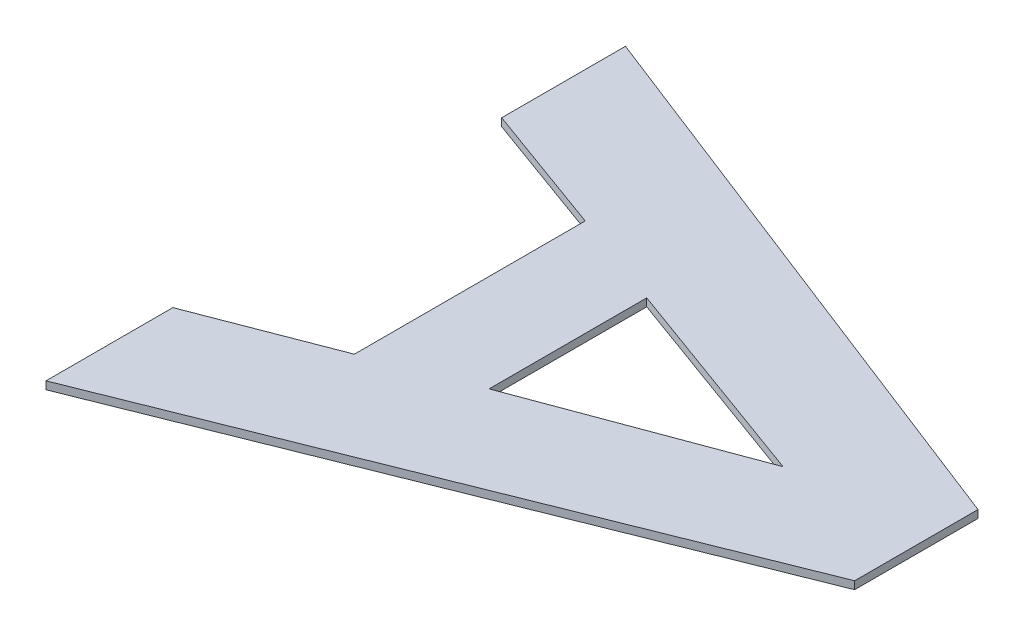
ISO-10303-21;
HEADER;
FILE_DESCRIPTION(('STEP AP214'),'2;1');
FILE_NAME('part.step','',(''),(''),'','','');
FILE_SCHEMA(('AUTOMOTIVE_DESIGN { 1 0 10303 214 1 1 1 1 }'));
ENDSEC;
DATA;
#1=APPLICATION_CONTEXT('core data for automotive mechanical design processes');
#2=APPLICATION_PROTOCOL_DEFINITION('international standard','automotive_design',2000,#1);
#3=PRODUCT_CONTEXT('',#1,'mechanical');
#4=PRODUCT('Part','Part','',(#3));
#5=PRODUCT_RELATED_PRODUCT_CATEGORY('part','',(#4));
#6=PRODUCT_DEFINITION_FORMATION('','',#4);
#7=PRODUCT_DEFINITION_CONTEXT('part definition',#1,'design');
#8=PRODUCT_DEFINITION('design','',#6,#7);
#9=PRODUCT_DEFINITION_SHAPE('','',#8);
#10=(LENGTH_UNIT() NAMED_UNIT(*) SI_UNIT(.MILLI.,.METRE.));
#11=(NAMED_UNIT(*) PLANE_ANGLE_UNIT() SI_UNIT($,.RADIAN.));
#12=(NAMED_UNIT(*) SI_UNIT($,.STERADIAN.) SOLID_ANGLE_UNIT());
#13=UNCERTAINTY_MEASURE_WITH_UNIT(LENGTH_MEASURE(1.E-05),#10,'distance_accuracy_value','');
#14=(GEOMETRIC_REPRESENTATION_CONTEXT(3) GLOBAL_UNCERTAINTY_ASSIGNED_CONTEXT((#13)) GLOBAL_UNIT_ASSIGNED_CONTEXT((#10,
#11,#12)) REPRESENTATION_CONTEXT('',''));
#15=CARTESIAN_POINT('',(0.,0.,0.));
#16=DIRECTION('',(0.,0.,1.));
#17=DIRECTION('',(1.,0.,0.));
#18=AXIS2_PLACEMENT_3D('',#15,#16,#17);
#19=CARTESIAN_POINT('',(-8.631267976045,2.16,0.));
#20=DIRECTION('',(0.,1.,0.));
#21=DIRECTION('',(0.,0.,1.));
#22=AXIS2_PLACEMENT_3D('',#19,#20,#21);
#23=PLANE('',#22);
#24=DIRECTION('',(-0.933321058443034,0.,0.359042896973013));
#25=VECTOR('',#24,1.);
#26=CARTESIAN_POINT('',(-6.845573371896,2.16,4.641858652695));
#27=LINE('',#26,#25);
#28=CARTESIAN_POINT('',(0.200543494760665,2.16,1.93126063358213));
#29=VERTEX_POINT('',#28);
#30=CARTESIAN_POINT('',(0.369353284900612,2.16,1.86632054084499));
#31=VERTEX_POINT('',#30);
#32=EDGE_CURVE('E138',#29,#31,#27,.F.);
#33=ORIENTED_EDGE('',*,*,#32,.F.);
#34=DIRECTION('',(0.,0.,1.));
#35=VECTOR('',#34,1.);
#36=CARTESIAN_POINT('',(0.200543494761,2.16,0.));
#37=LINE('',#36,#35);
#38=CARTESIAN_POINT('',(0.200543494760657,2.16,2.09455826731014));
#39=VERTEX_POINT('',#38);
#40=EDGE_CURVE('E142',#39,#29,#37,.F.);
#41=ORIENTED_EDGE('',*,*,#40,.F.);
#42=DIRECTION('',(0.928357969364077,0.,-0.371687342693031));
#43=VECTOR('',#42,1.);
#44=CARTESIAN_POINT('',(-6.688394158193,2.16,4.852687151533));
#45=LINE('',#44,#43);
#46=CARTESIAN_POINT('',(0.943995590928639,2.16,1.7969018210221));
#47=VERTEX_POINT('',#46);
#48=EDGE_CURVE('E149',#47,#39,#45,.F.);
#49=ORIENTED_EDGE('',*,*,#48,.F.);
#50=DIRECTION('',(0.,0.,-1.));
#51=VECTOR('',#50,1.);
#52=CARTESIAN_POINT('',(0.943995590929,2.16,0.));
#53=LINE('',#52,#51);
#54=CARTESIAN_POINT('',(0.943995590928882,2.16,1.6380828143813));
#55=VERTEX_POINT('',#54);
#56=EDGE_CURVE('E120',#55,#47,#53,.F.);
#57=ORIENTED_EDGE('',*,*,#56,.F.);
#58=DIRECTION('',(-0.931818169402854,0.,-0.362925473300943));
#59=VECTOR('',#58,1.);
#60=CARTESIAN_POINT('',(-7.924030848166,2.16,-1.815844999363));
#61=LINE('',#60,#59);
#62=CARTESIAN_POINT('',(0.200543494760863,2.16,1.34852234782436));
#63=VERTEX_POINT('',#62);
#64=EDGE_CURVE('E122',#63,#55,#61,.F.);
#65=ORIENTED_EDGE('',*,*,#64,.F.);
#66=DIRECTION('',(0.,0.,1.));
#67=VECTOR('',#66,1.);
#68=CARTESIAN_POINT('',(0.200543494761,2.16,0.));
#69=LINE('',#68,#67);
#70=CARTESIAN_POINT('',(0.200543494761343,2.16,1.50785811912906));
#71=VERTEX_POINT('',#70);
#72=EDGE_CURVE('E126',#71,#63,#69,.F.);
#73=ORIENTED_EDGE('',*,*,#72,.F.);
#74=DIRECTION('',(0.939905383184015,0.,0.341435016748005));
#75=VECTOR('',#74,1.);
#76=CARTESIAN_POINT('',(-8.085570917019,2.16,-1.502199769231));
#77=LINE('',#76,#75);
#78=CARTESIAN_POINT('',(0.369353284901296,2.16,1.56918085922019));
#79=VERTEX_POINT('',#78);
#80=EDGE_CURVE('E130',#79,#71,#77,.F.);
#81=ORIENTED_EDGE('',*,*,#80,.F.);
#82=DIRECTION('',(0.,0.,1.));
#83=VECTOR('',#82,1.);
#84=CARTESIAN_POINT('',(0.369353284901,2.16,0.));
#85=LINE('',#84,#83);
#86=EDGE_CURVE('E134',#31,#79,#85,.F.);
#87=ORIENTED_EDGE('',*,*,#86,.F.);
#88=EDGE_LOOP('',(#33,#41,#49,#57,#65,#73,#81,#87));
#89=FACE_BOUND('',#88,.T.);
#90=DIRECTION('',(0.939707761266112,0.,0.341978542333041));
#91=VECTOR('',#90,1.);
#92=CARTESIAN_POINT('',(-8.083092928394,2.16,-1.506306048607));
#93=LINE('',#92,#91);
#94=CARTESIAN_POINT('',(0.770707173703373,2.16,1.71576976882234));
#95=VERTEX_POINT('',#94);
#96=CARTESIAN_POINT('',(0.49475484329054,2.16,1.61534516917652));
#97=VERTEX_POINT('',#96);
#98=EDGE_CURVE('E20',#95,#97,#93,.F.);
#99=ORIENTED_EDGE('',*,*,#98,.F.);
#100=DIRECTION('',(-0.937430728936135,0.,0.34817183752605));
#101=VECTOR('',#100,1.);
#102=CARTESIAN_POINT('',(-6.931521521557,2.16,4.576460201831));
#103=LINE('',#102,#101);
#104=CARTESIAN_POINT('',(0.494754843290101,2.16,1.81826142712227));
#105=VERTEX_POINT('',#104);
#106=EDGE_CURVE('E102',#105,#95,#103,.F.);
#107=ORIENTED_EDGE('',*,*,#106,.F.);
#108=DIRECTION('',(0.,0.,-1.));
#109=VECTOR('',#108,1.);
#110=CARTESIAN_POINT('',(0.49475484329,2.16,0.));
#111=LINE('',#110,#109);
#112=EDGE_CURVE('E110',#97,#105,#111,.F.);
#113=ORIENTED_EDGE('',*,*,#112,.F.);
#114=EDGE_LOOP('',(#99,#107,#113));
#115=FACE_BOUND('',#114,.T.);
#116=ADVANCED_FACE('F17',(#89,#115),#23,.T.);
#117=CARTESIAN_POINT('',(-8.083092928394,2.16,-1.506306048607));
#118=DIRECTION('',(-0.341978542333041,0.,0.939707761266112));
#119=DIRECTION('',(0.939707761266112,0.,0.341978542333041));
#120=AXIS2_PLACEMENT_3D('',#117,#118,#119);
#121=PLANE('',#120);
#122=ORIENTED_EDGE('',*,*,#98,.T.);
#123=DIRECTION('',(0.,1.,0.));
#124=VECTOR('',#123,1.);
#125=CARTESIAN_POINT('',(0.49475484329,2.16,1.615345169178));
#126=LINE('',#125,#124);
#127=CARTESIAN_POINT('',(0.49475484329054,2.15,1.61534516917652));
#128=VERTEX_POINT('',#127);
#129=EDGE_CURVE('E114',#128,#97,#126,.T.);
#130=ORIENTED_EDGE('',*,*,#129,.F.);
#131=DIRECTION('',(0.93970776126564,0.,0.341978542334337));
#132=VECTOR('',#131,1.);
#133=CARTESIAN_POINT('',(0.49475484329,2.15,1.615345169178));
#134=LINE('',#133,#132);
#135=CARTESIAN_POINT('',(0.770707173703677,2.15,1.71576976882151));
#136=VERTEX_POINT('',#135);
#137=EDGE_CURVE('E113',#128,#136,#134,.T.);
#138=ORIENTED_EDGE('',*,*,#137,.T.);
#139=DIRECTION('',(0.,1.,0.));
#140=VECTOR('',#139,1.);
#141=CARTESIAN_POINT('',(0.770707173703269,2.16,1.71576976882372));
#142=LINE('',#141,#140);
#143=EDGE_CURVE('E105',#95,#136,#142,.F.);
#144=ORIENTED_EDGE('',*,*,#143,.F.);
#145=EDGE_LOOP('',(#122,#130,#138,#144));
#146=FACE_BOUND('',#145,.T.);
#147=ADVANCED_FACE('F112',(#146),#121,.T.);
#148=CARTESIAN_POINT('',(-6.931521521557,2.16,4.576460201831));
#149=DIRECTION('',(-0.34817183752605,0.,-0.937430728936135));
#150=DIRECTION('',(-0.937430728936135,0.,0.34817183752605));
#151=AXIS2_PLACEMENT_3D('',#148,#149,#150);
#152=PLANE('',#151);
#153=ORIENTED_EDGE('',*,*,#106,.T.);
#154=ORIENTED_EDGE('',*,*,#143,.T.);
#155=DIRECTION('',(-0.937430728936591,0.,0.348171837524823));
#156=VECTOR('',#155,1.);
#157=CARTESIAN_POINT('',(0.770707173703001,2.15,1.715769768823));
#158=LINE('',#157,#156);
#159=CARTESIAN_POINT('',(0.494754843290203,2.15,1.81826142712254));
#160=VERTEX_POINT('',#159);
#161=EDGE_CURVE('E153',#136,#160,#158,.T.);
#162=ORIENTED_EDGE('',*,*,#161,.T.);
#163=DIRECTION('',(0.,1.,0.));
#164=VECTOR('',#163,1.);
#165=CARTESIAN_POINT('',(0.49475484329,2.16,1.818261427122));
#166=LINE('',#165,#164);
#167=EDGE_CURVE('E107',#105,#160,#166,.F.);
#168=ORIENTED_EDGE('',*,*,#167,.F.);
#169=EDGE_LOOP('',(#153,#154,#162,#168));
#170=FACE_BOUND('',#169,.T.);
#171=ADVANCED_FACE('F103',(#170),#152,.T.);
#172=CARTESIAN_POINT('',(0.49475484329,2.16,0.));
#173=DIRECTION('',(1.,0.,0.));
#174=DIRECTION('',(0.,0.,-1.));
#175=AXIS2_PLACEMENT_3D('',#172,#173,#174);
#176=PLANE('',#175);
#177=ORIENTED_EDGE('',*,*,#112,.T.);
#178=ORIENTED_EDGE('',*,*,#167,.T.);
#179=DIRECTION('',(0.,0.,1.));
#180=VECTOR('',#179,1.);
#181=CARTESIAN_POINT('',(0.49475484329,2.15,0.));
#182=LINE('',#181,#180);
#183=EDGE_CURVE('E155',#160,#128,#182,.F.);
#184=ORIENTED_EDGE('',*,*,#183,.T.);
#185=ORIENTED_EDGE('',*,*,#129,.T.);
#186=EDGE_LOOP('',(#177,#178,#184,#185));
#187=FACE_BOUND('',#186,.T.);
#188=ADVANCED_FACE('F238',(#187),#176,.T.);
#189=CARTESIAN_POINT('',(0.943995590929,2.16,0.));
#190=DIRECTION('',(1.,0.,0.));
#191=DIRECTION('',(0.,0.,-1.));
#192=AXIS2_PLACEMENT_3D('',#189,#190,#191);
#193=PLANE('',#192);
#194=ORIENTED_EDGE('',*,*,#56,.T.);
#195=DIRECTION('',(0.,1.,0.));
#196=VECTOR('',#195,1.);
#197=CARTESIAN_POINT('',(0.943995590927556,2.16,1.79690182101939));
#198=LINE('',#197,#196);
#199=CARTESIAN_POINT('',(0.943995590928639,2.15,1.7969018210221));
#200=VERTEX_POINT('',#199);
#201=EDGE_CURVE('E146',#200,#47,#198,.T.);
#202=ORIENTED_EDGE('',*,*,#201,.F.);
#203=DIRECTION('',(0.,0.,1.));
#204=VECTOR('',#203,1.);
#205=CARTESIAN_POINT('',(0.943995590929,2.15,0.));
#206=LINE('',#205,#204);
#207=CARTESIAN_POINT('',(0.943995590928882,2.15,1.6380828143813));
#208=VERTEX_POINT('',#207);
#209=EDGE_CURVE('E158',#200,#208,#206,.F.);
#210=ORIENTED_EDGE('',*,*,#209,.T.);
#211=DIRECTION('',(0.,1.,0.));
#212=VECTOR('',#211,1.);
#213=CARTESIAN_POINT('',(0.943995590928531,2.16,1.63808281438221));
#214=LINE('',#213,#212);
#215=EDGE_CURVE('E124',#55,#208,#214,.F.);
#216=ORIENTED_EDGE('',*,*,#215,.F.);
#217=EDGE_LOOP('',(#194,#202,#210,#216));
#218=FACE_BOUND('',#217,.T.);
#219=ADVANCED_FACE('F211',(#218),#193,.T.);
#220=CARTESIAN_POINT('',(-7.924030848166,2.16,-1.815844999363));
#221=DIRECTION('',(0.362925473300943,0.,-0.931818169402854));
#222=DIRECTION('',(-0.931818169402854,0.,-0.362925473300943));
#223=AXIS2_PLACEMENT_3D('',#220,#221,#222);
#224=PLANE('',#223);
#225=ORIENTED_EDGE('',*,*,#64,.T.);
#226=ORIENTED_EDGE('',*,*,#215,.T.);
#227=DIRECTION('',(-0.931818169402749,0.,-0.362925473301213));
#228=VECTOR('',#227,1.);
#229=CARTESIAN_POINT('',(0.943995590929,2.15,1.638082814381));
#230=LINE('',#229,#228);
#231=CARTESIAN_POINT('',(0.200543494760724,2.15,1.34852234782471));
#232=VERTEX_POINT('',#231);
#233=EDGE_CURVE('E161',#208,#232,#230,.T.);
#234=ORIENTED_EDGE('',*,*,#233,.T.);
#235=DIRECTION('',(0.,1.,0.));
#236=VECTOR('',#235,1.);
#237=CARTESIAN_POINT('',(0.200543494761,2.16,1.348522347824));
#238=LINE('',#237,#236);
#239=EDGE_CURVE('E128',#63,#232,#238,.F.);
#240=ORIENTED_EDGE('',*,*,#239,.F.);
#241=EDGE_LOOP('',(#225,#226,#234,#240));
#242=FACE_BOUND('',#241,.T.);
#243=ADVANCED_FACE('F207',(#242),#224,.T.);
#244=CARTESIAN_POINT('',(0.200543494761,2.16,0.));
#245=DIRECTION('',(-1.,0.,0.));
#246=DIRECTION('',(0.,0.,1.));
#247=AXIS2_PLACEMENT_3D('',#244,#245,#246);
#248=PLANE('',#247);
#249=ORIENTED_EDGE('',*,*,#72,.T.);
#250=ORIENTED_EDGE('',*,*,#239,.T.);
#251=DIRECTION('',(0.,0.,1.));
#252=VECTOR('',#251,1.);
#253=CARTESIAN_POINT('',(0.200543494761,2.15,0.));
#254=LINE('',#253,#252);
#255=CARTESIAN_POINT('',(0.200543494761343,2.15,1.50785811912906));
#256=VERTEX_POINT('',#255);
#257=EDGE_CURVE('E164',#232,#256,#254,.T.);
#258=ORIENTED_EDGE('',*,*,#257,.T.);
#259=DIRECTION('',(0.,1.,0.));
#260=VECTOR('',#259,1.);
#261=CARTESIAN_POINT('',(0.200543494762374,2.16,1.50785811912622));
#262=LINE('',#261,#260);
#263=EDGE_CURVE('E132',#71,#256,#262,.F.);
#264=ORIENTED_EDGE('',*,*,#263,.F.);
#265=EDGE_LOOP('',(#249,#250,#258,#264));
#266=FACE_BOUND('',#265,.T.);
#267=ADVANCED_FACE('F202',(#266),#248,.T.);
#268=CARTESIAN_POINT('',(-8.085570917019,2.16,-1.502199769231));
#269=DIRECTION('',(-0.341435016748005,0.,0.939905383184015));
#270=DIRECTION('',(0.939905383184015,0.,0.341435016748005));
#271=AXIS2_PLACEMENT_3D('',#268,#269,#270);
#272=PLANE('',#271);
#273=ORIENTED_EDGE('',*,*,#80,.T.);
#274=ORIENTED_EDGE('',*,*,#263,.T.);
#275=DIRECTION('',(0.939905383185066,0.,0.341435016745112));
#276=VECTOR('',#275,1.);
#277=CARTESIAN_POINT('',(0.200543494761,2.15,1.50785811913));
#278=LINE('',#277,#276);
#279=CARTESIAN_POINT('',(0.369353284901592,2.15,1.56918085921937));
#280=VERTEX_POINT('',#279);
#281=EDGE_CURVE('E167',#256,#280,#278,.T.);
#282=ORIENTED_EDGE('',*,*,#281,.T.);
#283=DIRECTION('',(0.,1.,0.));
#284=VECTOR('',#283,1.);
#285=CARTESIAN_POINT('',(0.369353284901,2.16,1.569180859221));
#286=LINE('',#285,#284);
#287=EDGE_CURVE('E136',#79,#280,#286,.F.);
#288=ORIENTED_EDGE('',*,*,#287,.F.);
#289=EDGE_LOOP('',(#273,#274,#282,#288));
#290=FACE_BOUND('',#289,.T.);
#291=ADVANCED_FACE('F198',(#290),#272,.T.);
#292=CARTESIAN_POINT('',(0.369353284901,2.16,0.));
#293=DIRECTION('',(-1.,0.,0.));
#294=DIRECTION('',(0.,0.,1.));
#295=AXIS2_PLACEMENT_3D('',#292,#293,#294);
#296=PLANE('',#295);
#297=ORIENTED_EDGE('',*,*,#86,.T.);
#298=ORIENTED_EDGE('',*,*,#287,.T.);
#299=DIRECTION('',(0.,0.,1.));
#300=VECTOR('',#299,1.);
#301=CARTESIAN_POINT('',(0.369353284901,2.15,0.));
#302=LINE('',#301,#300);
#303=CARTESIAN_POINT('',(0.369353284900612,2.15,1.86632054084499));
#304=VERTEX_POINT('',#303);
#305=EDGE_CURVE('E170',#280,#304,#302,.T.);
#306=ORIENTED_EDGE('',*,*,#305,.T.);
#307=DIRECTION('',(0.,1.,0.));
#308=VECTOR('',#307,1.);
#309=CARTESIAN_POINT('',(0.369353284899448,2.16,1.86632054084197));
#310=LINE('',#309,#308);
#311=EDGE_CURVE('E140',#31,#304,#310,.F.);
#312=ORIENTED_EDGE('',*,*,#311,.F.);
#313=EDGE_LOOP('',(#297,#298,#306,#312));
#314=FACE_BOUND('',#313,.T.);
#315=ADVANCED_FACE('F192',(#314),#296,.T.);
#316=CARTESIAN_POINT('',(-6.845573371896,2.16,4.641858652695));
#317=DIRECTION('',(-0.359042896973013,0.,-0.933321058443034));
#318=DIRECTION('',(-0.933321058443034,0.,0.359042896973013));
#319=AXIS2_PLACEMENT_3D('',#316,#317,#318);
#320=PLANE('',#319);
#321=ORIENTED_EDGE('',*,*,#32,.T.);
#322=ORIENTED_EDGE('',*,*,#311,.T.);
#323=DIRECTION('',(-0.933321058444198,0.,0.359042896969989));
#324=VECTOR('',#323,1.);
#325=CARTESIAN_POINT('',(0.369353284901,2.15,1.866320540846));
#326=LINE('',#325,#324);
#327=CARTESIAN_POINT('',(0.20054349476033,2.15,1.93126063358126));
#328=VERTEX_POINT('',#327);
#329=EDGE_CURVE('E173',#304,#328,#326,.T.);
#330=ORIENTED_EDGE('',*,*,#329,.T.);
#331=DIRECTION('',(0.,1.,0.));
#332=VECTOR('',#331,1.);
#333=CARTESIAN_POINT('',(0.200543494761,2.16,1.931260633583));
#334=LINE('',#333,#332);
#335=EDGE_CURVE('E144',#29,#328,#334,.F.);
#336=ORIENTED_EDGE('',*,*,#335,.F.);
#337=EDGE_LOOP('',(#321,#322,#330,#336));
#338=FACE_BOUND('',#337,.T.);
#339=ADVANCED_FACE('F187',(#338),#320,.T.);
#340=CARTESIAN_POINT('',(0.200543494761,2.16,0.));
#341=DIRECTION('',(-1.,0.,0.));
#342=DIRECTION('',(0.,0.,1.));
#343=AXIS2_PLACEMENT_3D('',#340,#341,#342);
#344=PLANE('',#343);
#345=ORIENTED_EDGE('',*,*,#40,.T.);
#346=ORIENTED_EDGE('',*,*,#335,.T.);
#347=DIRECTION('',(0.,0.,1.));
#348=VECTOR('',#347,1.);
#349=CARTESIAN_POINT('',(0.200543494761,2.15,0.));
#350=LINE('',#349,#348);
#351=CARTESIAN_POINT('',(0.200543494760657,2.15,2.09455826731014));
#352=VERTEX_POINT('',#351);
#353=EDGE_CURVE('E26',#328,#352,#350,.T.);
#354=ORIENTED_EDGE('',*,*,#353,.T.);
#355=DIRECTION('',(0.,1.,0.));
#356=VECTOR('',#355,1.);
#357=CARTESIAN_POINT('',(0.200543494759627,2.16,2.09455826730757));
#358=LINE('',#357,#356);
#359=EDGE_CURVE('E34',#39,#352,#358,.F.);
#360=ORIENTED_EDGE('',*,*,#359,.F.);
#361=EDGE_LOOP('',(#345,#346,#354,#360));
#362=FACE_BOUND('',#361,.T.);
#363=ADVANCED_FACE('F179',(#362),#344,.T.);
#364=CARTESIAN_POINT('',(-6.688394158193,2.16,4.852687151533));
#365=DIRECTION('',(0.371687342693031,0.,0.928357969364077));
#366=DIRECTION('',(0.928357969364077,0.,-0.371687342693031));
#367=AXIS2_PLACEMENT_3D('',#364,#365,#366);
#368=PLANE('',#367);
#369=ORIENTED_EDGE('',*,*,#48,.T.);
#370=ORIENTED_EDGE('',*,*,#359,.T.);
#371=DIRECTION('',(0.928357969364166,0.,-0.371687342692808));
#372=VECTOR('',#371,1.);
#373=CARTESIAN_POINT('',(0.200543494761,2.15,2.094558267311));
#374=LINE('',#373,#372);
#375=EDGE_CURVE('E11',#352,#200,#374,.T.);
#376=ORIENTED_EDGE('',*,*,#375,.T.);
#377=ORIENTED_EDGE('',*,*,#201,.T.);
#378=EDGE_LOOP('',(#369,#370,#376,#377));
#379=FACE_BOUND('',#378,.T.);
#380=ADVANCED_FACE('F214',(#379),#368,.T.);
#381=CARTESIAN_POINT('',(-8.631267976045,2.15,0.));
#382=DIRECTION('',(0.,1.,0.));
#383=DIRECTION('',(0.,0.,1.));
#384=AXIS2_PLACEMENT_3D('',#381,#382,#383);
#385=PLANE('',#384);
#386=ORIENTED_EDGE('',*,*,#353,.F.);
#387=ORIENTED_EDGE('',*,*,#329,.F.);
#388=ORIENTED_EDGE('',*,*,#305,.F.);
#389=ORIENTED_EDGE('',*,*,#281,.F.);
#390=ORIENTED_EDGE('',*,*,#257,.F.);
#391=ORIENTED_EDGE('',*,*,#233,.F.);
#392=ORIENTED_EDGE('',*,*,#209,.F.);
#393=ORIENTED_EDGE('',*,*,#375,.F.);
#394=EDGE_LOOP('',(#386,#387,#388,#389,#390,#391,#392,#393));
#395=FACE_BOUND('',#394,.T.);
#396=ORIENTED_EDGE('',*,*,#161,.F.);
#397=ORIENTED_EDGE('',*,*,#137,.F.);
#398=ORIENTED_EDGE('',*,*,#183,.F.);
#399=EDGE_LOOP('',(#396,#397,#398));
#400=FACE_BOUND('',#399,.T.);
#401=ADVANCED_FACE('F183',(#395,#400),#385,.F.);
#402=CLOSED_SHELL('',(#116,#147,#171,#188,#219,#243,#267,#291,#315,#339,#363,#380,#401));
#403=MANIFOLD_SOLID_BREP('B1',#402);
#404=ADVANCED_BREP_SHAPE_REPRESENTATION('',(#18,#403),#14);
#405=SHAPE_DEFINITION_REPRESENTATION(#9,#404);
ENDSEC;
END-ISO-10303-21;
